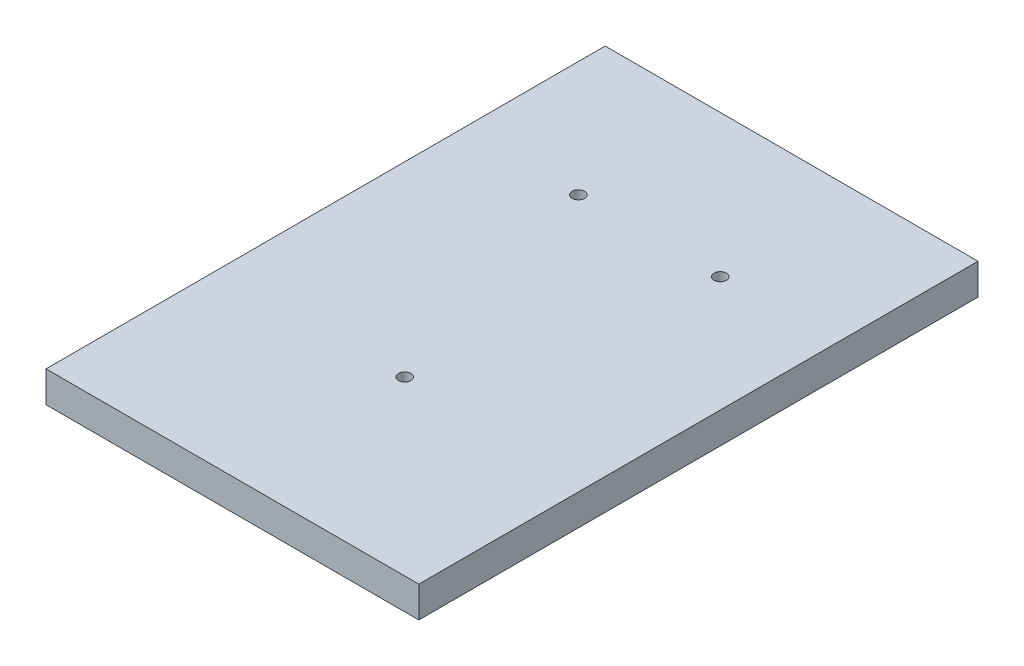
ISO-10303-21;
HEADER;
FILE_DESCRIPTION(('STEP AP214'),'2;1');
FILE_NAME('part.step','',(''),(''),'','','');
FILE_SCHEMA(('AUTOMOTIVE_DESIGN { 1 0 10303 214 1 1 1 1 }'));
ENDSEC;
DATA;
#1=APPLICATION_CONTEXT('core data for automotive mechanical design processes');
#2=APPLICATION_PROTOCOL_DEFINITION('international standard','automotive_design',2000,#1);
#3=PRODUCT_CONTEXT('',#1,'mechanical');
#4=PRODUCT('Part','Part','',(#3));
#5=PRODUCT_RELATED_PRODUCT_CATEGORY('part','',(#4));
#6=PRODUCT_DEFINITION_FORMATION('','',#4);
#7=PRODUCT_DEFINITION_CONTEXT('part definition',#1,'design');
#8=PRODUCT_DEFINITION('design','',#6,#7);
#9=PRODUCT_DEFINITION_SHAPE('','',#8);
#10=(LENGTH_UNIT() NAMED_UNIT(*) SI_UNIT(.MILLI.,.METRE.));
#11=(NAMED_UNIT(*) PLANE_ANGLE_UNIT() SI_UNIT($,.RADIAN.));
#12=(NAMED_UNIT(*) SI_UNIT($,.STERADIAN.) SOLID_ANGLE_UNIT());
#13=UNCERTAINTY_MEASURE_WITH_UNIT(LENGTH_MEASURE(1.E-05),#10,'distance_accuracy_value','');
#14=(GEOMETRIC_REPRESENTATION_CONTEXT(3) GLOBAL_UNCERTAINTY_ASSIGNED_CONTEXT((#13)) GLOBAL_UNIT_ASSIGNED_CONTEXT((#10,
#11,#12)) REPRESENTATION_CONTEXT('',''));
#15=CARTESIAN_POINT('',(0.,0.,0.));
#16=DIRECTION('',(0.,0.,1.));
#17=DIRECTION('',(1.,0.,0.));
#18=AXIS2_PLACEMENT_3D('',#15,#16,#17);
#19=CARTESIAN_POINT('',(0.,6.35,0.));
#20=DIRECTION('',(0.,-1.,0.));
#21=DIRECTION('',(0.,0.,-1.));
#22=AXIS2_PLACEMENT_3D('',#19,#20,#21);
#23=PLANE('',#22);
#24=DIRECTION('',(0.,0.,-1.));
#25=VECTOR('',#24,1.);
#26=CARTESIAN_POINT('',(38.1,6.35,57.15));
#27=LINE('',#26,#25);
#28=CARTESIAN_POINT('',(38.1,6.35,57.15));
#29=VERTEX_POINT('',#28);
#30=CARTESIAN_POINT('',(38.1,6.35,-57.15));
#31=VERTEX_POINT('',#30);
#32=EDGE_CURVE('E84',#29,#31,#27,.T.);
#33=ORIENTED_EDGE('',*,*,#32,.T.);
#34=DIRECTION('',(-1.,0.,0.));
#35=VECTOR('',#34,1.);
#36=CARTESIAN_POINT('',(-38.1,6.35,-57.15));
#37=LINE('',#36,#35);
#38=CARTESIAN_POINT('',(-38.1,6.35,-57.15));
#39=VERTEX_POINT('',#38);
#40=EDGE_CURVE('E79',#31,#39,#37,.T.);
#41=ORIENTED_EDGE('',*,*,#40,.T.);
#42=DIRECTION('',(0.,0.,1.));
#43=VECTOR('',#42,1.);
#44=CARTESIAN_POINT('',(-38.1,6.35,57.15));
#45=LINE('',#44,#43);
#46=CARTESIAN_POINT('',(-38.1,6.35,57.15));
#47=VERTEX_POINT('',#46);
#48=EDGE_CURVE('E82',#39,#47,#45,.T.);
#49=ORIENTED_EDGE('',*,*,#48,.T.);
#50=DIRECTION('',(1.,0.,0.));
#51=VECTOR('',#50,1.);
#52=CARTESIAN_POINT('',(-38.1,6.35,57.15));
#53=LINE('',#52,#51);
#54=EDGE_CURVE('E49',#47,#29,#53,.T.);
#55=ORIENTED_EDGE('',*,*,#54,.T.);
#56=EDGE_LOOP('',(#33,#41,#49,#55));
#57=FACE_BOUND('',#56,.T.);
#58=CARTESIAN_POINT('',(-14.5,6.35,-28.0703245355222));
#59=DIRECTION('',(0.,1.,0.));
#60=DIRECTION('',(0.,0.,1.));
#61=AXIS2_PLACEMENT_3D('',#58,#59,#60);
#62=CIRCLE('',#61,1.27);
#63=CARTESIAN_POINT('',(-14.5,6.35,-26.8003245355222));
#64=VERTEX_POINT('',#63);
#65=EDGE_CURVE('E99',#64,#64,#62,.T.);
#66=ORIENTED_EDGE('',*,*,#65,.F.);
#67=EDGE_LOOP('',(#66));
#68=FACE_BOUND('',#67,.T.);
#69=CARTESIAN_POINT('',(14.5,6.35,-28.0703245355222));
#70=DIRECTION('',(0.,1.,0.));
#71=DIRECTION('',(0.,0.,1.));
#72=AXIS2_PLACEMENT_3D('',#69,#70,#71);
#73=CIRCLE('',#72,1.27);
#74=CARTESIAN_POINT('',(14.5,6.35,-26.8003245355222));
#75=VERTEX_POINT('',#74);
#76=EDGE_CURVE('E114',#75,#75,#73,.T.);
#77=ORIENTED_EDGE('',*,*,#76,.F.);
#78=EDGE_LOOP('',(#77));
#79=FACE_BOUND('',#78,.T.);
#80=CARTESIAN_POINT('',(0.,6.35,21.9296754644778));
#81=DIRECTION('',(0.,1.,0.));
#82=DIRECTION('',(0.,0.,1.));
#83=AXIS2_PLACEMENT_3D('',#80,#81,#82);
#84=CIRCLE('',#83,1.27);
#85=CARTESIAN_POINT('',(0.,6.35,23.1996754644778));
#86=VERTEX_POINT('',#85);
#87=EDGE_CURVE('E120',#86,#86,#84,.T.);
#88=ORIENTED_EDGE('',*,*,#87,.F.);
#89=EDGE_LOOP('',(#88));
#90=FACE_BOUND('',#89,.T.);
#91=ADVANCED_FACE('F32',(#57,#68,#79,#90),#23,.F.);
#92=CARTESIAN_POINT('',(0.,0.,0.));
#93=DIRECTION('',(0.,-1.,0.));
#94=DIRECTION('',(0.,0.,-1.));
#95=AXIS2_PLACEMENT_3D('',#92,#93,#94);
#96=PLANE('',#95);
#97=CARTESIAN_POINT('',(14.5,0.,-28.0703245355222));
#98=DIRECTION('',(0.,1.,0.));
#99=DIRECTION('',(0.,0.,1.));
#100=AXIS2_PLACEMENT_3D('',#97,#98,#99);
#101=CIRCLE('',#100,1.27);
#102=CARTESIAN_POINT('',(14.5,0.,-26.8003245355222));
#103=VERTEX_POINT('',#102);
#104=EDGE_CURVE('E117',#103,#103,#101,.T.);
#105=ORIENTED_EDGE('',*,*,#104,.T.);
#106=EDGE_LOOP('',(#105));
#107=FACE_BOUND('',#106,.T.);
#108=DIRECTION('',(0.,0.,-1.));
#109=VECTOR('',#108,1.);
#110=CARTESIAN_POINT('',(38.1,0.,57.15));
#111=LINE('',#110,#109);
#112=CARTESIAN_POINT('',(38.1,0.,57.15));
#113=VERTEX_POINT('',#112);
#114=CARTESIAN_POINT('',(38.1,0.,-57.15));
#115=VERTEX_POINT('',#114);
#116=EDGE_CURVE('E96',#113,#115,#111,.T.);
#117=ORIENTED_EDGE('',*,*,#116,.F.);
#118=DIRECTION('',(1.,0.,0.));
#119=VECTOR('',#118,1.);
#120=CARTESIAN_POINT('',(-38.1,0.,57.15));
#121=LINE('',#120,#119);
#122=CARTESIAN_POINT('',(-38.1,0.,57.15));
#123=VERTEX_POINT('',#122);
#124=EDGE_CURVE('E72',#123,#113,#121,.T.);
#125=ORIENTED_EDGE('',*,*,#124,.F.);
#126=DIRECTION('',(0.,0.,1.));
#127=VECTOR('',#126,1.);
#128=CARTESIAN_POINT('',(-38.1,0.,57.15));
#129=LINE('',#128,#127);
#130=CARTESIAN_POINT('',(-38.1,0.,-57.15));
#131=VERTEX_POINT('',#130);
#132=EDGE_CURVE('E66',#131,#123,#129,.T.);
#133=ORIENTED_EDGE('',*,*,#132,.F.);
#134=DIRECTION('',(-1.,0.,0.));
#135=VECTOR('',#134,1.);
#136=CARTESIAN_POINT('',(-38.1,0.,-57.15));
#137=LINE('',#136,#135);
#138=EDGE_CURVE('E88',#115,#131,#137,.T.);
#139=ORIENTED_EDGE('',*,*,#138,.F.);
#140=EDGE_LOOP('',(#117,#125,#133,#139));
#141=FACE_BOUND('',#140,.T.);
#142=CARTESIAN_POINT('',(-14.5,0.,-28.0703245355222));
#143=DIRECTION('',(0.,1.,0.));
#144=DIRECTION('',(0.,0.,1.));
#145=AXIS2_PLACEMENT_3D('',#142,#143,#144);
#146=CIRCLE('',#145,1.27);
#147=CARTESIAN_POINT('',(-14.5,0.,-26.8003245355222));
#148=VERTEX_POINT('',#147);
#149=EDGE_CURVE('E111',#148,#148,#146,.T.);
#150=ORIENTED_EDGE('',*,*,#149,.T.);
#151=EDGE_LOOP('',(#150));
#152=FACE_BOUND('',#151,.T.);
#153=CARTESIAN_POINT('',(0.,0.,21.9296754644778));
#154=DIRECTION('',(0.,1.,0.));
#155=DIRECTION('',(0.,0.,1.));
#156=AXIS2_PLACEMENT_3D('',#153,#154,#155);
#157=CIRCLE('',#156,1.27);
#158=CARTESIAN_POINT('',(0.,0.,23.1996754644778));
#159=VERTEX_POINT('',#158);
#160=EDGE_CURVE('E123',#159,#159,#157,.T.);
#161=ORIENTED_EDGE('',*,*,#160,.T.);
#162=EDGE_LOOP('',(#161));
#163=FACE_BOUND('',#162,.T.);
#164=ADVANCED_FACE('F107',(#107,#141,#152,#163),#96,.T.);
#165=CARTESIAN_POINT('',(38.1,6.35,57.15));
#166=DIRECTION('',(-1.,0.,0.));
#167=DIRECTION('',(0.,0.,1.));
#168=AXIS2_PLACEMENT_3D('',#165,#166,#167);
#169=PLANE('',#168);
#170=ORIENTED_EDGE('',*,*,#116,.T.);
#171=DIRECTION('',(0.,-1.,0.));
#172=VECTOR('',#171,1.);
#173=CARTESIAN_POINT('',(38.1,6.35,-57.15));
#174=LINE('',#173,#172);
#175=EDGE_CURVE('E11',#31,#115,#174,.T.);
#176=ORIENTED_EDGE('',*,*,#175,.F.);
#177=ORIENTED_EDGE('',*,*,#32,.F.);
#178=DIRECTION('',(0.,-1.,0.));
#179=VECTOR('',#178,1.);
#180=CARTESIAN_POINT('',(38.1,6.35,57.15));
#181=LINE('',#180,#179);
#182=EDGE_CURVE('E92',#29,#113,#181,.T.);
#183=ORIENTED_EDGE('',*,*,#182,.T.);
#184=EDGE_LOOP('',(#170,#176,#177,#183));
#185=FACE_BOUND('',#184,.T.);
#186=ADVANCED_FACE('F34',(#185),#169,.F.);
#187=CARTESIAN_POINT('',(-38.1,6.35,-57.15));
#188=DIRECTION('',(0.,0.,1.));
#189=DIRECTION('',(1.,0.,0.));
#190=AXIS2_PLACEMENT_3D('',#187,#188,#189);
#191=PLANE('',#190);
#192=ORIENTED_EDGE('',*,*,#138,.T.);
#193=DIRECTION('',(0.,-1.,0.));
#194=VECTOR('',#193,1.);
#195=CARTESIAN_POINT('',(-38.1,6.35,-57.15));
#196=LINE('',#195,#194);
#197=EDGE_CURVE('E41',#39,#131,#196,.T.);
#198=ORIENTED_EDGE('',*,*,#197,.F.);
#199=ORIENTED_EDGE('',*,*,#40,.F.);
#200=ORIENTED_EDGE('',*,*,#175,.T.);
#201=EDGE_LOOP('',(#192,#198,#199,#200));
#202=FACE_BOUND('',#201,.T.);
#203=ADVANCED_FACE('F87',(#202),#191,.F.);
#204=CARTESIAN_POINT('',(-38.1,6.35,57.15));
#205=DIRECTION('',(1.,0.,0.));
#206=DIRECTION('',(0.,0.,-1.));
#207=AXIS2_PLACEMENT_3D('',#204,#205,#206);
#208=PLANE('',#207);
#209=ORIENTED_EDGE('',*,*,#132,.T.);
#210=DIRECTION('',(0.,-1.,0.));
#211=VECTOR('',#210,1.);
#212=CARTESIAN_POINT('',(-38.1,6.35,57.15));
#213=LINE('',#212,#211);
#214=EDGE_CURVE('E89',#47,#123,#213,.T.);
#215=ORIENTED_EDGE('',*,*,#214,.F.);
#216=ORIENTED_EDGE('',*,*,#48,.F.);
#217=ORIENTED_EDGE('',*,*,#197,.T.);
#218=EDGE_LOOP('',(#209,#215,#216,#217));
#219=FACE_BOUND('',#218,.T.);
#220=ADVANCED_FACE('F90',(#219),#208,.F.);
#221=CARTESIAN_POINT('',(-38.1,6.35,57.15));
#222=DIRECTION('',(0.,0.,-1.));
#223=DIRECTION('',(-1.,0.,0.));
#224=AXIS2_PLACEMENT_3D('',#221,#222,#223);
#225=PLANE('',#224);
#226=ORIENTED_EDGE('',*,*,#124,.T.);
#227=ORIENTED_EDGE('',*,*,#182,.F.);
#228=ORIENTED_EDGE('',*,*,#54,.F.);
#229=ORIENTED_EDGE('',*,*,#214,.T.);
#230=EDGE_LOOP('',(#226,#227,#228,#229));
#231=FACE_BOUND('',#230,.T.);
#232=ADVANCED_FACE('F104',(#231),#225,.F.);
#233=CARTESIAN_POINT('',(-14.5,6.35,-28.0703245355222));
#234=DIRECTION('',(0.,-1.,0.));
#235=DIRECTION('',(0.,0.,-1.));
#236=AXIS2_PLACEMENT_3D('',#233,#234,#235);
#237=CYLINDRICAL_SURFACE('',#236,1.27);
#238=ORIENTED_EDGE('',*,*,#65,.T.);
#239=EDGE_LOOP('',(#238));
#240=FACE_BOUND('',#239,.T.);
#241=ORIENTED_EDGE('',*,*,#149,.F.);
#242=EDGE_LOOP('',(#241));
#243=FACE_BOUND('',#242,.T.);
#244=ADVANCED_FACE('F140',(#240,#243),#237,.F.);
#245=CARTESIAN_POINT('',(14.5,6.35,-28.0703245355222));
#246=DIRECTION('',(0.,-1.,0.));
#247=DIRECTION('',(0.,0.,-1.));
#248=AXIS2_PLACEMENT_3D('',#245,#246,#247);
#249=CYLINDRICAL_SURFACE('',#248,1.27);
#250=ORIENTED_EDGE('',*,*,#76,.T.);
#251=EDGE_LOOP('',(#250));
#252=FACE_BOUND('',#251,.T.);
#253=ORIENTED_EDGE('',*,*,#104,.F.);
#254=EDGE_LOOP('',(#253));
#255=FACE_BOUND('',#254,.T.);
#256=ADVANCED_FACE('F186',(#252,#255),#249,.F.);
#257=CARTESIAN_POINT('',(0.,6.35,21.9296754644778));
#258=DIRECTION('',(0.,-1.,0.));
#259=DIRECTION('',(0.,0.,-1.));
#260=AXIS2_PLACEMENT_3D('',#257,#258,#259);
#261=CYLINDRICAL_SURFACE('',#260,1.27);
#262=ORIENTED_EDGE('',*,*,#87,.T.);
#263=EDGE_LOOP('',(#262));
#264=FACE_BOUND('',#263,.T.);
#265=ORIENTED_EDGE('',*,*,#160,.F.);
#266=EDGE_LOOP('',(#265));
#267=FACE_BOUND('',#266,.T.);
#268=ADVANCED_FACE('F129',(#264,#267),#261,.F.);
#269=CLOSED_SHELL('',(#91,#164,#186,#203,#220,#232,#244,#256,#268));
#270=MANIFOLD_SOLID_BREP('B2',#269);
#271=ADVANCED_BREP_SHAPE_REPRESENTATION('',(#18,#270),#14);
#272=SHAPE_DEFINITION_REPRESENTATION(#9,#271);
ENDSEC;
END-ISO-10303-21;
